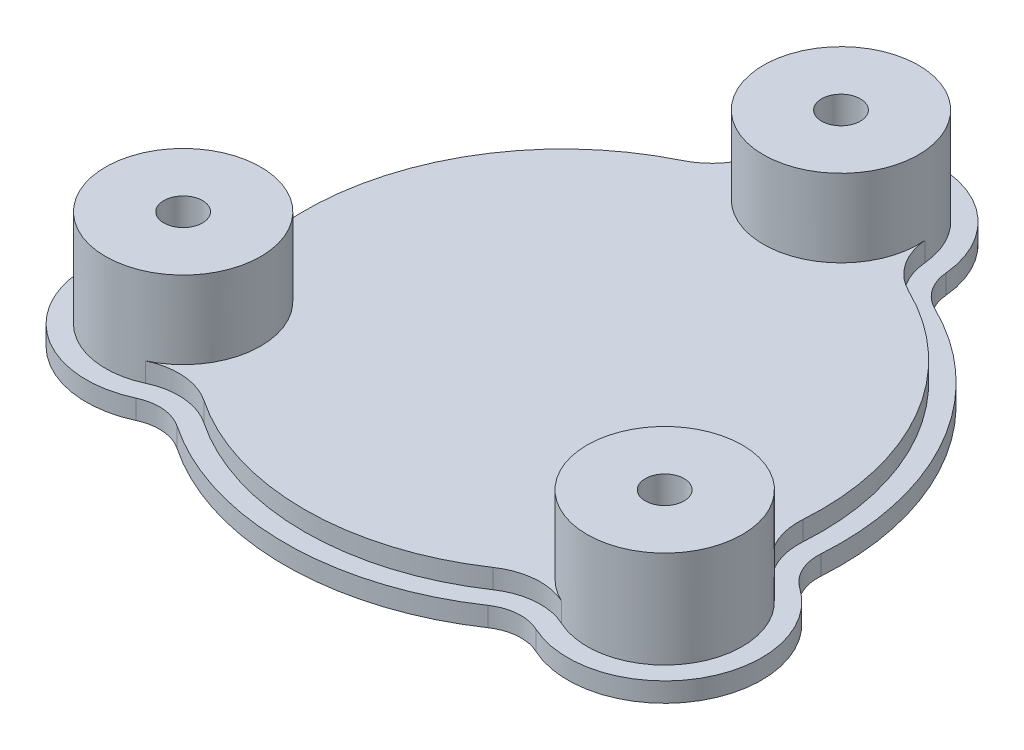
ISO-10303-21;
HEADER;
FILE_DESCRIPTION(('STEP AP214'),'2;1');
FILE_NAME('part.step','',(''),(''),'','','');
FILE_SCHEMA(('AUTOMOTIVE_DESIGN { 1 0 10303 214 1 1 1 1 }'));
ENDSEC;
DATA;
#1=APPLICATION_CONTEXT('core data for automotive mechanical design processes');
#2=APPLICATION_PROTOCOL_DEFINITION('international standard','automotive_design',2000,#1);
#3=PRODUCT_CONTEXT('',#1,'mechanical');
#4=PRODUCT('Part','Part','',(#3));
#5=PRODUCT_RELATED_PRODUCT_CATEGORY('part','',(#4));
#6=PRODUCT_DEFINITION_FORMATION('','',#4);
#7=PRODUCT_DEFINITION_CONTEXT('part definition',#1,'design');
#8=PRODUCT_DEFINITION('design','',#6,#7);
#9=PRODUCT_DEFINITION_SHAPE('','',#8);
#10=(LENGTH_UNIT() NAMED_UNIT(*) SI_UNIT(.MILLI.,.METRE.));
#11=(NAMED_UNIT(*) PLANE_ANGLE_UNIT() SI_UNIT($,.RADIAN.));
#12=(NAMED_UNIT(*) SI_UNIT($,.STERADIAN.) SOLID_ANGLE_UNIT());
#13=UNCERTAINTY_MEASURE_WITH_UNIT(LENGTH_MEASURE(1.E-05),#10,'distance_accuracy_value','');
#14=(GEOMETRIC_REPRESENTATION_CONTEXT(3) GLOBAL_UNCERTAINTY_ASSIGNED_CONTEXT((#13)) GLOBAL_UNIT_ASSIGNED_CONTEXT((#10,
#11,#12)) REPRESENTATION_CONTEXT('',''));
#15=CARTESIAN_POINT('',(0.,0.,0.));
#16=DIRECTION('',(0.,0.,1.));
#17=DIRECTION('',(1.,0.,0.));
#18=AXIS2_PLACEMENT_3D('',#15,#16,#17);
#19=CARTESIAN_POINT('',(43.5584755901521,6.,12.496367642724));
#20=DIRECTION('',(0.,1.,0.));
#21=DIRECTION('',(0.,0.,1.));
#22=AXIS2_PLACEMENT_3D('',#19,#20,#21);
#23=PLANE('',#22);
#24=CARTESIAN_POINT('',(27.963726894679,6.,41.4491251796682));
#25=DIRECTION('',(0.,-1.,0.));
#26=DIRECTION('',(0.,0.,1.));
#27=AXIS2_PLACEMENT_3D('',#24,#25,#26);
#28=CIRCLE('',#27,10.);
#29=CARTESIAN_POINT('',(22.3709815157432,6.,33.1593001437346));
#30=VERTEX_POINT('',#29);
#31=CARTESIAN_POINT('',(32.1798021074299,6.,32.3813410070917));
#32=VERTEX_POINT('',#31);
#33=EDGE_CURVE('E229',#30,#32,#28,.T.);
#34=ORIENTED_EDGE('',*,*,#33,.T.);
#35=CARTESIAN_POINT('',(37.2390923627309,6.,21.5));
#36=DIRECTION('',(0.,1.,0.));
#37=DIRECTION('',(0.,0.,1.));
#38=AXIS2_PLACEMENT_3D('',#35,#36,#37);
#39=CIRCLE('',#38,12.0000000000002);
#40=CARTESIAN_POINT('',(44.1329649744632,6.,11.6778556102443));
#41=VERTEX_POINT('',#40);
#42=EDGE_CURVE('E212',#41,#32,#39,.T.);
#43=ORIENTED_EDGE('',*,*,#42,.F.);
#44=CARTESIAN_POINT('',(49.8778588175734,6.,3.49273528544806));
#45=DIRECTION('',(0.,-1.,0.));
#46=DIRECTION('',(0.,0.,1.));
#47=AXIS2_PLACEMENT_3D('',#44,#45,#46);
#48=CIRCLE('',#47,9.99999999999999);
#49=CARTESIAN_POINT('',(39.9022870540587,6.,2.79418822835846));
#50=VERTEX_POINT('',#49);
#51=EDGE_CURVE('E220',#41,#50,#48,.T.);
#52=ORIENTED_EDGE('',*,*,#51,.T.);
#53=CARTESIAN_POINT('',(0.,6.,0.));
#54=DIRECTION('',(0.,1.,0.));
#55=DIRECTION('',(0.,0.,1.));
#56=AXIS2_PLACEMENT_3D('',#53,#54,#55);
#57=CIRCLE('',#56,40.);
#58=CARTESIAN_POINT('',(17.5313055383155,6.,-35.953488372093));
#59=VERTEX_POINT('',#58);
#60=EDGE_CURVE('E226',#50,#59,#57,.T.);
#61=ORIENTED_EDGE('',*,*,#60,.T.);
#62=CARTESIAN_POINT('',(21.9141319228944,6.,-44.9418604651163));
#63=DIRECTION('',(0.,-1.,0.));
#64=DIRECTION('',(0.,0.,1.));
#65=AXIS2_PLACEMENT_3D('',#62,#63,#64);
#66=CIRCLE('',#65,10.);
#67=CARTESIAN_POINT('',(11.9531628670333,6.,-44.0591966173361));
#68=VERTEX_POINT('',#67);
#69=EDGE_CURVE('E254',#59,#68,#66,.T.);
#70=ORIENTED_EDGE('',*,*,#69,.T.);
#71=CARTESIAN_POINT('',(0.,6.,-43.));
#72=DIRECTION('',(0.,1.,0.));
#73=DIRECTION('',(0.,0.,1.));
#74=AXIS2_PLACEMENT_3D('',#71,#72,#73);
#75=CIRCLE('',#74,12.);
#76=CARTESIAN_POINT('',(-11.9531628670333,6.,-44.0591966173361));
#77=VERTEX_POINT('',#76);
#78=EDGE_CURVE('E12',#77,#68,#75,.T.);
#79=ORIENTED_EDGE('',*,*,#78,.F.);
#80=CARTESIAN_POINT('',(-21.9141319228944,6.,-44.9418604651163));
#81=DIRECTION('',(0.,-1.,0.));
#82=DIRECTION('',(0.,0.,1.));
#83=AXIS2_PLACEMENT_3D('',#80,#81,#82);
#84=CIRCLE('',#83,10.);
#85=CARTESIAN_POINT('',(-17.5313055383155,6.,-35.953488372093));
#86=VERTEX_POINT('',#85);
#87=EDGE_CURVE('E258',#77,#86,#84,.T.);
#88=ORIENTED_EDGE('',*,*,#87,.T.);
#89=CARTESIAN_POINT('',(0.,6.,0.));
#90=DIRECTION('',(0.,1.,0.));
#91=DIRECTION('',(0.,0.,1.));
#92=AXIS2_PLACEMENT_3D('',#89,#90,#91);
#93=CIRCLE('',#92,40.);
#94=CARTESIAN_POINT('',(-39.7921258564291,6.,4.07267968616522));
#95=VERTEX_POINT('',#94);
#96=EDGE_CURVE('E261',#86,#95,#93,.T.);
#97=ORIENTED_EDGE('',*,*,#96,.T.);
#98=CARTESIAN_POINT('',(-47.1517620795026,6.,4.82593024260501));
#99=DIRECTION('',(0.,-1.,0.));
#100=DIRECTION('',(0.,0.,1.));
#101=AXIS2_PLACEMENT_3D('',#98,#99,#100);
#102=CIRCLE('',#101,7.39808297714696);
#103=CARTESIAN_POINT('',(-43.3712465937133,6.,11.1851231472478));
#104=VERTEX_POINT('',#103);
#105=EDGE_CURVE('E264',#95,#104,#102,.T.);
#106=ORIENTED_EDGE('',*,*,#105,.T.);
#107=CARTESIAN_POINT('',(-37.2390923627308,6.,21.5));
#108=DIRECTION('',(0.,1.,0.));
#109=DIRECTION('',(0.,0.,1.));
#110=AXIS2_PLACEMENT_3D('',#107,#108,#109);
#111=CIRCLE('',#110,12.0000000000004);
#112=CARTESIAN_POINT('',(-32.1798021074298,6.,32.3813410070919));
#113=VERTEX_POINT('',#112);
#114=EDGE_CURVE('E238',#113,#104,#111,.T.);
#115=ORIENTED_EDGE('',*,*,#114,.F.);
#116=CARTESIAN_POINT('',(-27.963726894679,6.,41.4491251796682));
#117=DIRECTION('',(0.,-1.,0.));
#118=DIRECTION('',(0.,0.,1.));
#119=AXIS2_PLACEMENT_3D('',#116,#117,#118);
#120=CIRCLE('',#119,10.);
#121=CARTESIAN_POINT('',(-22.3709815157432,6.,33.1593001437346));
#122=VERTEX_POINT('',#121);
#123=EDGE_CURVE('E267',#113,#122,#120,.T.);
#124=ORIENTED_EDGE('',*,*,#123,.T.);
#125=CARTESIAN_POINT('',(0.,6.,0.));
#126=DIRECTION('',(0.,1.,0.));
#127=DIRECTION('',(0.,0.,1.));
#128=AXIS2_PLACEMENT_3D('',#125,#126,#127);
#129=CIRCLE('',#128,40.);
#130=EDGE_CURVE('E270',#122,#30,#129,.T.);
#131=ORIENTED_EDGE('',*,*,#130,.T.);
#132=EDGE_LOOP('',(#34,#43,#52,#61,#70,#79,#88,#97,#106,#115,#124,#131));
#133=FACE_BOUND('',#132,.T.);
#134=ADVANCED_FACE('F45',(#133),#23,.T.);
#135=CARTESIAN_POINT('',(0.,3.,0.));
#136=DIRECTION('',(0.,1.,0.));
#137=DIRECTION('',(0.,0.,1.));
#138=AXIS2_PLACEMENT_3D('',#135,#136,#137);
#139=PLANE('',#138);
#140=CARTESIAN_POINT('',(27.963726894679,3.,41.4491251796682));
#141=DIRECTION('',(0.,1.,0.));
#142=DIRECTION('',(0.,0.,1.));
#143=AXIS2_PLACEMENT_3D('',#140,#141,#142);
#144=CIRCLE('',#143,7.);
#145=CARTESIAN_POINT('',(24.048805129424,3.,35.6462476545146));
#146=VERTEX_POINT('',#145);
#147=CARTESIAN_POINT('',(30.9149795436046,3.,35.1016762588647));
#148=VERTEX_POINT('',#147);
#149=EDGE_CURVE('E358',#146,#148,#144,.F.);
#150=ORIENTED_EDGE('',*,*,#149,.T.);
#151=CARTESIAN_POINT('',(37.2390923627309,3.,21.5));
#152=DIRECTION('',(0.,1.,0.));
#153=DIRECTION('',(0.,0.,1.));
#154=AXIS2_PLACEMENT_3D('',#151,#152,#153);
#155=CIRCLE('',#154,15.);
#156=CARTESIAN_POINT('',(45.8564331273963,3.,9.2223195128055));
#157=VERTEX_POINT('',#156);
#158=EDGE_CURVE('E362',#148,#157,#155,.T.);
#159=ORIENTED_EDGE('',*,*,#158,.T.);
#160=CARTESIAN_POINT('',(49.8778588175734,3.,3.49273528544806));
#161=DIRECTION('',(0.,1.,0.));
#162=DIRECTION('',(0.,0.,1.));
#163=AXIS2_PLACEMENT_3D('',#160,#161,#162);
#164=CIRCLE('',#163,7.);
#165=CARTESIAN_POINT('',(42.8949585831131,3.,3.00375234548533));
#166=VERTEX_POINT('',#165);
#167=EDGE_CURVE('E366',#166,#157,#164,.T.);
#168=ORIENTED_EDGE('',*,*,#167,.F.);
#169=CARTESIAN_POINT('',(0.,3.,0.));
#170=DIRECTION('',(0.,1.,0.));
#171=DIRECTION('',(0.,0.,1.));
#172=AXIS2_PLACEMENT_3D('',#169,#170,#171);
#173=CIRCLE('',#172,43.);
#174=CARTESIAN_POINT('',(18.8461534536892,3.,-38.65));
#175=VERTEX_POINT('',#174);
#176=EDGE_CURVE('E370',#166,#175,#173,.T.);
#177=ORIENTED_EDGE('',*,*,#176,.T.);
#178=CARTESIAN_POINT('',(21.9141319228944,3.,-44.9418604651163));
#179=DIRECTION('',(0.,1.,0.));
#180=DIRECTION('',(0.,0.,1.));
#181=AXIS2_PLACEMENT_3D('',#178,#179,#180);
#182=CIRCLE('',#181,7.);
#183=CARTESIAN_POINT('',(14.9414535837916,3.,-44.3239957716702));
#184=VERTEX_POINT('',#183);
#185=EDGE_CURVE('E373',#184,#175,#182,.T.);
#186=ORIENTED_EDGE('',*,*,#185,.F.);
#187=CARTESIAN_POINT('',(0.,3.,-43.));
#188=DIRECTION('',(0.,1.,0.));
#189=DIRECTION('',(0.,0.,1.));
#190=AXIS2_PLACEMENT_3D('',#187,#188,#189);
#191=CIRCLE('',#190,15.);
#192=CARTESIAN_POINT('',(-14.9414535837916,3.,-44.3239957716702));
#193=VERTEX_POINT('',#192);
#194=EDGE_CURVE('E377',#184,#193,#191,.T.);
#195=ORIENTED_EDGE('',*,*,#194,.T.);
#196=CARTESIAN_POINT('',(-21.9141319228944,3.,-44.9418604651163));
#197=DIRECTION('',(0.,1.,0.));
#198=DIRECTION('',(0.,0.,1.));
#199=AXIS2_PLACEMENT_3D('',#196,#197,#198);
#200=CIRCLE('',#199,7.);
#201=CARTESIAN_POINT('',(-18.8461534536892,3.,-38.65));
#202=VERTEX_POINT('',#201);
#203=EDGE_CURVE('E380',#202,#193,#200,.T.);
#204=ORIENTED_EDGE('',*,*,#203,.F.);
#205=CARTESIAN_POINT('',(0.,3.,0.));
#206=DIRECTION('',(0.,1.,0.));
#207=DIRECTION('',(0.,0.,1.));
#208=AXIS2_PLACEMENT_3D('',#205,#206,#207);
#209=CIRCLE('',#208,43.);
#210=CARTESIAN_POINT('',(-42.7765352956613,3.,4.37813066262762));
#211=VERTEX_POINT('',#210);
#212=EDGE_CURVE('E384',#202,#211,#209,.T.);
#213=ORIENTED_EDGE('',*,*,#212,.T.);
#214=CARTESIAN_POINT('',(-47.1517620795026,3.,4.82593024260501));
#215=DIRECTION('',(0.,1.,0.));
#216=DIRECTION('',(0.,0.,1.));
#217=AXIS2_PLACEMENT_3D('',#214,#215,#216);
#218=CIRCLE('',#217,4.39808297714695);
#219=CARTESIAN_POINT('',(-44.9042851514589,3.,8.60640393405973));
#220=VERTEX_POINT('',#219);
#221=EDGE_CURVE('E387',#220,#211,#218,.T.);
#222=ORIENTED_EDGE('',*,*,#221,.F.);
#223=CARTESIAN_POINT('',(-37.2390923627309,3.,21.5));
#224=DIRECTION('',(0.,1.,0.));
#225=DIRECTION('',(0.,0.,1.));
#226=AXIS2_PLACEMENT_3D('',#223,#224,#225);
#227=CIRCLE('',#226,15.);
#228=CARTESIAN_POINT('',(-30.9149795436046,3.,35.1016762588647));
#229=VERTEX_POINT('',#228);
#230=EDGE_CURVE('E391',#220,#229,#227,.T.);
#231=ORIENTED_EDGE('',*,*,#230,.T.);
#232=CARTESIAN_POINT('',(-27.963726894679,3.,41.4491251796682));
#233=DIRECTION('',(0.,1.,0.));
#234=DIRECTION('',(0.,0.,1.));
#235=AXIS2_PLACEMENT_3D('',#232,#233,#234);
#236=CIRCLE('',#235,7.00000000000001);
#237=CARTESIAN_POINT('',(-24.0488051294239,3.,35.6462476545147));
#238=VERTEX_POINT('',#237);
#239=EDGE_CURVE('E394',#229,#238,#236,.F.);
#240=ORIENTED_EDGE('',*,*,#239,.T.);
#241=CARTESIAN_POINT('',(0.,3.,0.));
#242=DIRECTION('',(0.,1.,0.));
#243=DIRECTION('',(0.,0.,1.));
#244=AXIS2_PLACEMENT_3D('',#241,#242,#243);
#245=CIRCLE('',#244,43.);
#246=EDGE_CURVE('E397',#238,#146,#245,.T.);
#247=ORIENTED_EDGE('',*,*,#246,.T.);
#248=EDGE_LOOP('',(#150,#159,#168,#177,#186,#195,#204,#213,#222,#231,#240,#247));
#249=FACE_BOUND('',#248,.T.);
#250=CARTESIAN_POINT('',(37.2390923627309,3.,21.5));
#251=DIRECTION('',(0.,1.,0.));
#252=DIRECTION('',(0.,0.,1.));
#253=AXIS2_PLACEMENT_3D('',#250,#251,#252);
#254=CIRCLE('',#253,12.);
#255=CARTESIAN_POINT('',(32.1798021074299,3.,32.3813410070917));
#256=VERTEX_POINT('',#255);
#257=CARTESIAN_POINT('',(44.1329649744632,3.,11.6778556102444));
#258=VERTEX_POINT('',#257);
#259=EDGE_CURVE('E62',#256,#258,#254,.T.);
#260=ORIENTED_EDGE('',*,*,#259,.F.);
#261=CARTESIAN_POINT('',(27.963726894679,3.,41.4491251796682));
#262=DIRECTION('',(0.,-1.,0.));
#263=DIRECTION('',(0.,0.,1.));
#264=AXIS2_PLACEMENT_3D('',#261,#262,#263);
#265=CIRCLE('',#264,10.);
#266=CARTESIAN_POINT('',(22.3709815157432,3.,33.1593001437346));
#267=VERTEX_POINT('',#266);
#268=EDGE_CURVE('E66',#267,#256,#265,.T.);
#269=ORIENTED_EDGE('',*,*,#268,.F.);
#270=CARTESIAN_POINT('',(0.,3.,0.));
#271=DIRECTION('',(0.,1.,0.));
#272=DIRECTION('',(0.,0.,1.));
#273=AXIS2_PLACEMENT_3D('',#270,#271,#272);
#274=CIRCLE('',#273,40.);
#275=CARTESIAN_POINT('',(-22.3709815157432,3.,33.1593001437346));
#276=VERTEX_POINT('',#275);
#277=EDGE_CURVE('E313',#276,#267,#274,.T.);
#278=ORIENTED_EDGE('',*,*,#277,.F.);
#279=CARTESIAN_POINT('',(-27.963726894679,3.,41.4491251796682));
#280=DIRECTION('',(0.,-1.,0.));
#281=DIRECTION('',(0.,0.,1.));
#282=AXIS2_PLACEMENT_3D('',#279,#280,#281);
#283=CIRCLE('',#282,10.);
#284=CARTESIAN_POINT('',(-32.1798021074298,3.,32.3813410070917));
#285=VERTEX_POINT('',#284);
#286=EDGE_CURVE('E309',#285,#276,#283,.T.);
#287=ORIENTED_EDGE('',*,*,#286,.F.);
#288=CARTESIAN_POINT('',(-37.2390923627309,3.,21.5));
#289=DIRECTION('',(0.,1.,0.));
#290=DIRECTION('',(0.,0.,1.));
#291=AXIS2_PLACEMENT_3D('',#288,#289,#290);
#292=CIRCLE('',#291,12.);
#293=CARTESIAN_POINT('',(-43.3712465937133,3.,11.1851231472478));
#294=VERTEX_POINT('',#293);
#295=EDGE_CURVE('E305',#294,#285,#292,.T.);
#296=ORIENTED_EDGE('',*,*,#295,.F.);
#297=CARTESIAN_POINT('',(-47.1517620795026,3.,4.82593024260501));
#298=DIRECTION('',(0.,-1.,0.));
#299=DIRECTION('',(0.,0.,1.));
#300=AXIS2_PLACEMENT_3D('',#297,#298,#299);
#301=CIRCLE('',#300,7.39808297714696);
#302=CARTESIAN_POINT('',(-39.7921258564291,3.,4.07267968616522));
#303=VERTEX_POINT('',#302);
#304=EDGE_CURVE('E301',#303,#294,#301,.T.);
#305=ORIENTED_EDGE('',*,*,#304,.F.);
#306=CARTESIAN_POINT('',(0.,3.,0.));
#307=DIRECTION('',(0.,1.,0.));
#308=DIRECTION('',(0.,0.,1.));
#309=AXIS2_PLACEMENT_3D('',#306,#307,#308);
#310=CIRCLE('',#309,40.);
#311=CARTESIAN_POINT('',(-17.5313055383155,3.,-35.953488372093));
#312=VERTEX_POINT('',#311);
#313=EDGE_CURVE('E297',#312,#303,#310,.T.);
#314=ORIENTED_EDGE('',*,*,#313,.F.);
#315=CARTESIAN_POINT('',(-21.9141319228944,3.,-44.9418604651163));
#316=DIRECTION('',(0.,-1.,0.));
#317=DIRECTION('',(0.,0.,1.));
#318=AXIS2_PLACEMENT_3D('',#315,#316,#317);
#319=CIRCLE('',#318,10.);
#320=CARTESIAN_POINT('',(-11.9531628670333,3.,-44.0591966173361));
#321=VERTEX_POINT('',#320);
#322=EDGE_CURVE('E293',#321,#312,#319,.T.);
#323=ORIENTED_EDGE('',*,*,#322,.F.);
#324=CARTESIAN_POINT('',(0.,3.,-43.));
#325=DIRECTION('',(0.,1.,0.));
#326=DIRECTION('',(0.,0.,1.));
#327=AXIS2_PLACEMENT_3D('',#324,#325,#326);
#328=CIRCLE('',#327,12.);
#329=CARTESIAN_POINT('',(11.9531628670333,3.,-44.0591966173362));
#330=VERTEX_POINT('',#329);
#331=EDGE_CURVE('E289',#330,#321,#328,.T.);
#332=ORIENTED_EDGE('',*,*,#331,.F.);
#333=CARTESIAN_POINT('',(21.9141319228944,3.,-44.9418604651163));
#334=DIRECTION('',(0.,-1.,0.));
#335=DIRECTION('',(0.,0.,1.));
#336=AXIS2_PLACEMENT_3D('',#333,#334,#335);
#337=CIRCLE('',#336,10.);
#338=CARTESIAN_POINT('',(17.5313055383155,3.,-35.953488372093));
#339=VERTEX_POINT('',#338);
#340=EDGE_CURVE('E285',#339,#330,#337,.T.);
#341=ORIENTED_EDGE('',*,*,#340,.F.);
#342=CARTESIAN_POINT('',(0.,3.,0.));
#343=DIRECTION('',(0.,1.,0.));
#344=DIRECTION('',(0.,0.,1.));
#345=AXIS2_PLACEMENT_3D('',#342,#343,#344);
#346=CIRCLE('',#345,40.);
#347=CARTESIAN_POINT('',(39.9022870540587,3.,2.79418822835846));
#348=VERTEX_POINT('',#347);
#349=EDGE_CURVE('E281',#348,#339,#346,.T.);
#350=ORIENTED_EDGE('',*,*,#349,.F.);
#351=CARTESIAN_POINT('',(49.8778588175734,3.,3.49273528544806));
#352=DIRECTION('',(0.,-1.,0.));
#353=DIRECTION('',(0.,0.,1.));
#354=AXIS2_PLACEMENT_3D('',#351,#352,#353);
#355=CIRCLE('',#354,9.99999999999999);
#356=EDGE_CURVE('E278',#258,#348,#355,.T.);
#357=ORIENTED_EDGE('',*,*,#356,.F.);
#358=EDGE_LOOP('',(#260,#269,#278,#287,#296,#305,#314,#323,#332,#341,#350,#357));
#359=FACE_BOUND('',#358,.T.);
#360=ADVANCED_FACE('F515',(#249,#359),#139,.T.);
#361=CARTESIAN_POINT('',(27.963726894679,3.,41.4491251796682));
#362=DIRECTION('',(0.,-1.,0.));
#363=DIRECTION('',(0.,0.,-1.));
#364=AXIS2_PLACEMENT_3D('',#361,#362,#363);
#365=CYLINDRICAL_SURFACE('',#364,7.);
#366=CARTESIAN_POINT('',(27.963726894679,0.,41.4491251796682));
#367=DIRECTION('',(0.,1.,0.));
#368=DIRECTION('',(0.,0.,1.));
#369=AXIS2_PLACEMENT_3D('',#366,#367,#368);
#370=CIRCLE('',#369,7.);
#371=CARTESIAN_POINT('',(24.048805129424,0.,35.6462476545146));
#372=VERTEX_POINT('',#371);
#373=CARTESIAN_POINT('',(30.9149795436046,0.,35.1016762588647));
#374=VERTEX_POINT('',#373);
#375=EDGE_CURVE('E216',#372,#374,#370,.F.);
#376=ORIENTED_EDGE('',*,*,#375,.T.);
#377=DIRECTION('',(0.,-1.,0.));
#378=VECTOR('',#377,1.);
#379=CARTESIAN_POINT('',(30.9149795436046,3.,35.1016762588647));
#380=LINE('',#379,#378);
#381=EDGE_CURVE('E49',#148,#374,#380,.T.);
#382=ORIENTED_EDGE('',*,*,#381,.F.);
#383=ORIENTED_EDGE('',*,*,#149,.F.);
#384=DIRECTION('',(0.,-1.,0.));
#385=VECTOR('',#384,1.);
#386=CARTESIAN_POINT('',(24.048805129424,3.,35.6462476545146));
#387=LINE('',#386,#385);
#388=EDGE_CURVE('E400',#146,#372,#387,.T.);
#389=ORIENTED_EDGE('',*,*,#388,.T.);
#390=EDGE_LOOP('',(#376,#382,#383,#389));
#391=FACE_BOUND('',#390,.T.);
#392=ADVANCED_FACE('F47',(#391),#365,.F.);
#393=CARTESIAN_POINT('',(37.2390923627309,3.,21.5));
#394=DIRECTION('',(0.,-1.,0.));
#395=DIRECTION('',(0.,0.,-1.));
#396=AXIS2_PLACEMENT_3D('',#393,#394,#395);
#397=CYLINDRICAL_SURFACE('',#396,15.);
#398=CARTESIAN_POINT('',(37.2390923627309,0.,21.5));
#399=DIRECTION('',(0.,1.,0.));
#400=DIRECTION('',(0.,0.,1.));
#401=AXIS2_PLACEMENT_3D('',#398,#399,#400);
#402=CIRCLE('',#401,15.);
#403=CARTESIAN_POINT('',(45.8564331273963,0.,9.2223195128055));
#404=VERTEX_POINT('',#403);
#405=EDGE_CURVE('E404',#374,#404,#402,.T.);
#406=ORIENTED_EDGE('',*,*,#405,.T.);
#407=DIRECTION('',(0.,-1.,0.));
#408=VECTOR('',#407,1.);
#409=CARTESIAN_POINT('',(45.8564331273963,3.,9.2223195128055));
#410=LINE('',#409,#408);
#411=EDGE_CURVE('E487',#157,#404,#410,.T.);
#412=ORIENTED_EDGE('',*,*,#411,.F.);
#413=ORIENTED_EDGE('',*,*,#158,.F.);
#414=ORIENTED_EDGE('',*,*,#381,.T.);
#415=EDGE_LOOP('',(#406,#412,#413,#414));
#416=FACE_BOUND('',#415,.T.);
#417=ADVANCED_FACE('F496',(#416),#397,.T.);
#418=CARTESIAN_POINT('',(49.8778588175734,3.,3.49273528544806));
#419=DIRECTION('',(0.,-1.,0.));
#420=DIRECTION('',(0.,0.,-1.));
#421=AXIS2_PLACEMENT_3D('',#418,#419,#420);
#422=CYLINDRICAL_SURFACE('',#421,7.);
#423=CARTESIAN_POINT('',(49.8778588175734,0.,3.49273528544806));
#424=DIRECTION('',(0.,1.,0.));
#425=DIRECTION('',(0.,0.,1.));
#426=AXIS2_PLACEMENT_3D('',#423,#424,#425);
#427=CIRCLE('',#426,7.);
#428=CARTESIAN_POINT('',(42.8949585831131,0.,3.00375234548533));
#429=VERTEX_POINT('',#428);
#430=EDGE_CURVE('E408',#429,#404,#427,.T.);
#431=ORIENTED_EDGE('',*,*,#430,.F.);
#432=DIRECTION('',(0.,-1.,0.));
#433=VECTOR('',#432,1.);
#434=CARTESIAN_POINT('',(42.8949585831131,3.,3.00375234548533));
#435=LINE('',#434,#433);
#436=EDGE_CURVE('E485',#166,#429,#435,.T.);
#437=ORIENTED_EDGE('',*,*,#436,.F.);
#438=ORIENTED_EDGE('',*,*,#167,.T.);
#439=ORIENTED_EDGE('',*,*,#411,.T.);
#440=EDGE_LOOP('',(#431,#437,#438,#439));
#441=FACE_BOUND('',#440,.T.);
#442=ADVANCED_FACE('F507',(#441),#422,.F.);
#443=CARTESIAN_POINT('',(0.,3.,0.));
#444=DIRECTION('',(0.,-1.,0.));
#445=DIRECTION('',(0.,0.,-1.));
#446=AXIS2_PLACEMENT_3D('',#443,#444,#445);
#447=CYLINDRICAL_SURFACE('',#446,43.);
#448=CARTESIAN_POINT('',(0.,0.,0.));
#449=DIRECTION('',(0.,1.,0.));
#450=DIRECTION('',(0.,0.,1.));
#451=AXIS2_PLACEMENT_3D('',#448,#449,#450);
#452=CIRCLE('',#451,43.);
#453=CARTESIAN_POINT('',(18.8461534536892,0.,-38.65));
#454=VERTEX_POINT('',#453);
#455=EDGE_CURVE('E412',#429,#454,#452,.T.);
#456=ORIENTED_EDGE('',*,*,#455,.T.);
#457=DIRECTION('',(0.,-1.,0.));
#458=VECTOR('',#457,1.);
#459=CARTESIAN_POINT('',(18.8461534536892,3.,-38.65));
#460=LINE('',#459,#458);
#461=EDGE_CURVE('E482',#175,#454,#460,.T.);
#462=ORIENTED_EDGE('',*,*,#461,.F.);
#463=ORIENTED_EDGE('',*,*,#176,.F.);
#464=ORIENTED_EDGE('',*,*,#436,.T.);
#465=EDGE_LOOP('',(#456,#462,#463,#464));
#466=FACE_BOUND('',#465,.T.);
#467=ADVANCED_FACE('F512',(#466),#447,.T.);
#468=CARTESIAN_POINT('',(21.9141319228944,3.,-44.9418604651163));
#469=DIRECTION('',(0.,-1.,0.));
#470=DIRECTION('',(0.,0.,-1.));
#471=AXIS2_PLACEMENT_3D('',#468,#469,#470);
#472=CYLINDRICAL_SURFACE('',#471,7.);
#473=CARTESIAN_POINT('',(21.9141319228944,0.,-44.9418604651163));
#474=DIRECTION('',(0.,1.,0.));
#475=DIRECTION('',(0.,0.,1.));
#476=AXIS2_PLACEMENT_3D('',#473,#474,#475);
#477=CIRCLE('',#476,7.);
#478=CARTESIAN_POINT('',(14.9414535837916,0.,-44.3239957716702));
#479=VERTEX_POINT('',#478);
#480=EDGE_CURVE('E416',#479,#454,#477,.T.);
#481=ORIENTED_EDGE('',*,*,#480,.F.);
#482=DIRECTION('',(0.,-1.,0.));
#483=VECTOR('',#482,1.);
#484=CARTESIAN_POINT('',(14.9414535837916,3.,-44.3239957716702));
#485=LINE('',#484,#483);
#486=EDGE_CURVE('E479',#184,#479,#485,.T.);
#487=ORIENTED_EDGE('',*,*,#486,.F.);
#488=ORIENTED_EDGE('',*,*,#185,.T.);
#489=ORIENTED_EDGE('',*,*,#461,.T.);
#490=EDGE_LOOP('',(#481,#487,#488,#489));
#491=FACE_BOUND('',#490,.T.);
#492=ADVANCED_FACE('F547',(#491),#472,.F.);
#493=CARTESIAN_POINT('',(0.,3.,-43.));
#494=DIRECTION('',(0.,-1.,0.));
#495=DIRECTION('',(0.,0.,-1.));
#496=AXIS2_PLACEMENT_3D('',#493,#494,#495);
#497=CYLINDRICAL_SURFACE('',#496,15.);
#498=CARTESIAN_POINT('',(0.,0.,-43.));
#499=DIRECTION('',(0.,1.,0.));
#500=DIRECTION('',(0.,0.,1.));
#501=AXIS2_PLACEMENT_3D('',#498,#499,#500);
#502=CIRCLE('',#501,15.);
#503=CARTESIAN_POINT('',(-14.9414535837916,0.,-44.3239957716702));
#504=VERTEX_POINT('',#503);
#505=EDGE_CURVE('E420',#479,#504,#502,.T.);
#506=ORIENTED_EDGE('',*,*,#505,.T.);
#507=DIRECTION('',(0.,-1.,0.));
#508=VECTOR('',#507,1.);
#509=CARTESIAN_POINT('',(-14.9414535837916,3.,-44.3239957716702));
#510=LINE('',#509,#508);
#511=EDGE_CURVE('E476',#193,#504,#510,.T.);
#512=ORIENTED_EDGE('',*,*,#511,.F.);
#513=ORIENTED_EDGE('',*,*,#194,.F.);
#514=ORIENTED_EDGE('',*,*,#486,.T.);
#515=EDGE_LOOP('',(#506,#512,#513,#514));
#516=FACE_BOUND('',#515,.T.);
#517=ADVANCED_FACE('F544',(#516),#497,.T.);
#518=CARTESIAN_POINT('',(-21.9141319228944,3.,-44.9418604651163));
#519=DIRECTION('',(0.,-1.,0.));
#520=DIRECTION('',(0.,0.,-1.));
#521=AXIS2_PLACEMENT_3D('',#518,#519,#520);
#522=CYLINDRICAL_SURFACE('',#521,7.);
#523=CARTESIAN_POINT('',(-21.9141319228944,0.,-44.9418604651163));
#524=DIRECTION('',(0.,1.,0.));
#525=DIRECTION('',(0.,0.,1.));
#526=AXIS2_PLACEMENT_3D('',#523,#524,#525);
#527=CIRCLE('',#526,7.);
#528=CARTESIAN_POINT('',(-18.8461534536892,0.,-38.65));
#529=VERTEX_POINT('',#528);
#530=EDGE_CURVE('E424',#529,#504,#527,.T.);
#531=ORIENTED_EDGE('',*,*,#530,.F.);
#532=DIRECTION('',(0.,-1.,0.));
#533=VECTOR('',#532,1.);
#534=CARTESIAN_POINT('',(-18.8461534536892,3.,-38.65));
#535=LINE('',#534,#533);
#536=EDGE_CURVE('E473',#202,#529,#535,.T.);
#537=ORIENTED_EDGE('',*,*,#536,.F.);
#538=ORIENTED_EDGE('',*,*,#203,.T.);
#539=ORIENTED_EDGE('',*,*,#511,.T.);
#540=EDGE_LOOP('',(#531,#537,#538,#539));
#541=FACE_BOUND('',#540,.T.);
#542=ADVANCED_FACE('F539',(#541),#522,.F.);
#543=CARTESIAN_POINT('',(0.,3.,0.));
#544=DIRECTION('',(0.,-1.,0.));
#545=DIRECTION('',(0.,0.,-1.));
#546=AXIS2_PLACEMENT_3D('',#543,#544,#545);
#547=CYLINDRICAL_SURFACE('',#546,43.);
#548=CARTESIAN_POINT('',(0.,0.,0.));
#549=DIRECTION('',(0.,1.,0.));
#550=DIRECTION('',(0.,0.,1.));
#551=AXIS2_PLACEMENT_3D('',#548,#549,#550);
#552=CIRCLE('',#551,43.);
#553=CARTESIAN_POINT('',(-42.7765352956613,0.,4.37813066262762));
#554=VERTEX_POINT('',#553);
#555=EDGE_CURVE('E428',#529,#554,#552,.T.);
#556=ORIENTED_EDGE('',*,*,#555,.T.);
#557=DIRECTION('',(0.,-1.,0.));
#558=VECTOR('',#557,1.);
#559=CARTESIAN_POINT('',(-42.7765352956613,3.,4.37813066262762));
#560=LINE('',#559,#558);
#561=EDGE_CURVE('E470',#211,#554,#560,.T.);
#562=ORIENTED_EDGE('',*,*,#561,.F.);
#563=ORIENTED_EDGE('',*,*,#212,.F.);
#564=ORIENTED_EDGE('',*,*,#536,.T.);
#565=EDGE_LOOP('',(#556,#562,#563,#564));
#566=FACE_BOUND('',#565,.T.);
#567=ADVANCED_FACE('F535',(#566),#547,.T.);
#568=CARTESIAN_POINT('',(-47.1517620795026,3.,4.82593024260501));
#569=DIRECTION('',(0.,-1.,0.));
#570=DIRECTION('',(0.,0.,-1.));
#571=AXIS2_PLACEMENT_3D('',#568,#569,#570);
#572=CYLINDRICAL_SURFACE('',#571,4.39808297714695);
#573=CARTESIAN_POINT('',(-47.1517620795026,0.,4.82593024260501));
#574=DIRECTION('',(0.,1.,0.));
#575=DIRECTION('',(0.,0.,1.));
#576=AXIS2_PLACEMENT_3D('',#573,#574,#575);
#577=CIRCLE('',#576,4.39808297714695);
#578=CARTESIAN_POINT('',(-44.9042851514589,0.,8.60640393405973));
#579=VERTEX_POINT('',#578);
#580=EDGE_CURVE('E432',#579,#554,#577,.T.);
#581=ORIENTED_EDGE('',*,*,#580,.F.);
#582=DIRECTION('',(0.,-1.,0.));
#583=VECTOR('',#582,1.);
#584=CARTESIAN_POINT('',(-44.9042851514589,3.,8.60640393405973));
#585=LINE('',#584,#583);
#586=EDGE_CURVE('E467',#220,#579,#585,.T.);
#587=ORIENTED_EDGE('',*,*,#586,.F.);
#588=ORIENTED_EDGE('',*,*,#221,.T.);
#589=ORIENTED_EDGE('',*,*,#561,.T.);
#590=EDGE_LOOP('',(#581,#587,#588,#589));
#591=FACE_BOUND('',#590,.T.);
#592=ADVANCED_FACE('F529',(#591),#572,.F.);
#593=CARTESIAN_POINT('',(-37.2390923627309,3.,21.5));
#594=DIRECTION('',(0.,-1.,0.));
#595=DIRECTION('',(0.,0.,-1.));
#596=AXIS2_PLACEMENT_3D('',#593,#594,#595);
#597=CYLINDRICAL_SURFACE('',#596,15.);
#598=CARTESIAN_POINT('',(-37.2390923627309,0.,21.5));
#599=DIRECTION('',(0.,1.,0.));
#600=DIRECTION('',(0.,0.,1.));
#601=AXIS2_PLACEMENT_3D('',#598,#599,#600);
#602=CIRCLE('',#601,15.);
#603=CARTESIAN_POINT('',(-30.9149795436046,0.,35.1016762588647));
#604=VERTEX_POINT('',#603);
#605=EDGE_CURVE('E436',#579,#604,#602,.T.);
#606=ORIENTED_EDGE('',*,*,#605,.T.);
#607=DIRECTION('',(0.,-1.,0.));
#608=VECTOR('',#607,1.);
#609=CARTESIAN_POINT('',(-30.9149795436046,3.,35.1016762588647));
#610=LINE('',#609,#608);
#611=EDGE_CURVE('E463',#229,#604,#610,.T.);
#612=ORIENTED_EDGE('',*,*,#611,.F.);
#613=ORIENTED_EDGE('',*,*,#230,.F.);
#614=ORIENTED_EDGE('',*,*,#586,.T.);
#615=EDGE_LOOP('',(#606,#612,#613,#614));
#616=FACE_BOUND('',#615,.T.);
#617=ADVANCED_FACE('F548',(#616),#597,.T.);
#618=CARTESIAN_POINT('',(-27.963726894679,3.,41.4491251796682));
#619=DIRECTION('',(0.,-1.,0.));
#620=DIRECTION('',(0.,0.,-1.));
#621=AXIS2_PLACEMENT_3D('',#618,#619,#620);
#622=CYLINDRICAL_SURFACE('',#621,7.00000000000001);
#623=CARTESIAN_POINT('',(-27.963726894679,0.,41.4491251796682));
#624=DIRECTION('',(0.,1.,0.));
#625=DIRECTION('',(0.,0.,1.));
#626=AXIS2_PLACEMENT_3D('',#623,#624,#625);
#627=CIRCLE('',#626,7.00000000000001);
#628=CARTESIAN_POINT('',(-24.0488051294239,0.,35.6462476545147));
#629=VERTEX_POINT('',#628);
#630=EDGE_CURVE('E439',#604,#629,#627,.F.);
#631=ORIENTED_EDGE('',*,*,#630,.T.);
#632=DIRECTION('',(0.,-1.,0.));
#633=VECTOR('',#632,1.);
#634=CARTESIAN_POINT('',(-24.0488051294239,3.,35.6462476545147));
#635=LINE('',#634,#633);
#636=EDGE_CURVE('E459',#238,#629,#635,.T.);
#637=ORIENTED_EDGE('',*,*,#636,.F.);
#638=ORIENTED_EDGE('',*,*,#239,.F.);
#639=ORIENTED_EDGE('',*,*,#611,.T.);
#640=EDGE_LOOP('',(#631,#637,#638,#639));
#641=FACE_BOUND('',#640,.T.);
#642=ADVANCED_FACE('F522',(#641),#622,.F.);
#643=CARTESIAN_POINT('',(37.2390923627309,3.,21.5));
#644=DIRECTION('',(0.,-1.,0.));
#645=DIRECTION('',(0.,0.,-1.));
#646=AXIS2_PLACEMENT_3D('',#643,#644,#645);
#647=CYLINDRICAL_SURFACE('',#646,5.99999999999999);
#648=CARTESIAN_POINT('',(37.2390923627309,0.,21.5));
#649=DIRECTION('',(0.,1.,0.));
#650=DIRECTION('',(0.,0.,1.));
#651=AXIS2_PLACEMENT_3D('',#648,#649,#650);
#652=CIRCLE('',#651,5.99999999999999);
#653=CARTESIAN_POINT('',(37.2390923627309,0.,27.5));
#654=VERTEX_POINT('',#653);
#655=EDGE_CURVE('E449',#654,#654,#652,.T.);
#656=ORIENTED_EDGE('',*,*,#655,.F.);
#657=EDGE_LOOP('',(#656));
#658=FACE_BOUND('',#657,.T.);
#659=CARTESIAN_POINT('',(37.2390923627309,12.,21.5));
#660=DIRECTION('',(0.,-1.,0.));
#661=DIRECTION('',(0.,0.,-1.));
#662=AXIS2_PLACEMENT_3D('',#659,#660,#661);
#663=CIRCLE('',#662,5.99999999999999);
#664=CARTESIAN_POINT('',(37.2390923627309,12.,15.5));
#665=VERTEX_POINT('',#664);
#666=EDGE_CURVE('E1089',#665,#665,#663,.T.);
#667=ORIENTED_EDGE('',*,*,#666,.F.);
#668=EDGE_LOOP('',(#667));
#669=FACE_BOUND('',#668,.T.);
#670=ADVANCED_FACE('F555',(#658,#669),#647,.F.);
#671=CARTESIAN_POINT('',(-37.2390923627309,3.,21.5));
#672=DIRECTION('',(0.,-1.,0.));
#673=DIRECTION('',(0.,0.,-1.));
#674=AXIS2_PLACEMENT_3D('',#671,#672,#673);
#675=CYLINDRICAL_SURFACE('',#674,5.99999999999999);
#676=CARTESIAN_POINT('',(-37.2390923627309,0.,21.5));
#677=DIRECTION('',(0.,1.,0.));
#678=DIRECTION('',(0.,0.,1.));
#679=AXIS2_PLACEMENT_3D('',#676,#677,#678);
#680=CIRCLE('',#679,5.99999999999999);
#681=CARTESIAN_POINT('',(-37.2390923627309,0.,27.5));
#682=VERTEX_POINT('',#681);
#683=EDGE_CURVE('E445',#682,#682,#680,.T.);
#684=ORIENTED_EDGE('',*,*,#683,.F.);
#685=EDGE_LOOP('',(#684));
#686=FACE_BOUND('',#685,.T.);
#687=CARTESIAN_POINT('',(-37.2390923627309,12.,21.5));
#688=DIRECTION('',(0.,-1.,0.));
#689=DIRECTION('',(0.,0.,-1.));
#690=AXIS2_PLACEMENT_3D('',#687,#688,#689);
#691=CIRCLE('',#690,5.99999999999999);
#692=CARTESIAN_POINT('',(-37.2390923627309,12.,15.5));
#693=VERTEX_POINT('',#692);
#694=EDGE_CURVE('E1114',#693,#693,#691,.T.);
#695=ORIENTED_EDGE('',*,*,#694,.F.);
#696=EDGE_LOOP('',(#695));
#697=FACE_BOUND('',#696,.T.);
#698=ADVANCED_FACE('F620',(#686,#697),#675,.F.);
#699=CARTESIAN_POINT('',(0.,3.,0.));
#700=DIRECTION('',(0.,-1.,0.));
#701=DIRECTION('',(0.,0.,-1.));
#702=AXIS2_PLACEMENT_3D('',#699,#700,#701);
#703=CYLINDRICAL_SURFACE('',#702,43.);
#704=CARTESIAN_POINT('',(0.,0.,0.));
#705=DIRECTION('',(0.,1.,0.));
#706=DIRECTION('',(0.,0.,1.));
#707=AXIS2_PLACEMENT_3D('',#704,#705,#706);
#708=CIRCLE('',#707,43.);
#709=EDGE_CURVE('E442',#629,#372,#708,.T.);
#710=ORIENTED_EDGE('',*,*,#709,.T.);
#711=ORIENTED_EDGE('',*,*,#388,.F.);
#712=ORIENTED_EDGE('',*,*,#246,.F.);
#713=ORIENTED_EDGE('',*,*,#636,.T.);
#714=EDGE_LOOP('',(#710,#711,#712,#713));
#715=FACE_BOUND('',#714,.T.);
#716=ADVANCED_FACE('F520',(#715),#703,.T.);
#717=CARTESIAN_POINT('',(0.,3.,-43.));
#718=DIRECTION('',(0.,-1.,0.));
#719=DIRECTION('',(0.,0.,-1.));
#720=AXIS2_PLACEMENT_3D('',#717,#718,#719);
#721=CYLINDRICAL_SURFACE('',#720,6.);
#722=CARTESIAN_POINT('',(0.,0.,-43.));
#723=DIRECTION('',(0.,1.,0.));
#724=DIRECTION('',(0.,0.,1.));
#725=AXIS2_PLACEMENT_3D('',#722,#723,#724);
#726=CIRCLE('',#725,6.);
#727=CARTESIAN_POINT('',(0.,0.,-37.));
#728=VERTEX_POINT('',#727);
#729=EDGE_CURVE('E363',#728,#728,#726,.T.);
#730=ORIENTED_EDGE('',*,*,#729,.F.);
#731=EDGE_LOOP('',(#730));
#732=FACE_BOUND('',#731,.T.);
#733=CARTESIAN_POINT('',(0.,12.,-43.));
#734=DIRECTION('',(0.,-1.,0.));
#735=DIRECTION('',(0.,0.,-1.));
#736=AXIS2_PLACEMENT_3D('',#733,#734,#735);
#737=CIRCLE('',#736,6.);
#738=CARTESIAN_POINT('',(0.,12.,-49.));
#739=VERTEX_POINT('',#738);
#740=EDGE_CURVE('E1118',#739,#739,#737,.T.);
#741=ORIENTED_EDGE('',*,*,#740,.F.);
#742=EDGE_LOOP('',(#741));
#743=FACE_BOUND('',#742,.T.);
#744=ADVANCED_FACE('F614',(#732,#743),#721,.F.);
#745=CARTESIAN_POINT('',(0.,0.,0.));
#746=DIRECTION('',(0.,1.,0.));
#747=DIRECTION('',(0.,0.,1.));
#748=AXIS2_PLACEMENT_3D('',#745,#746,#747);
#749=PLANE('',#748);
#750=ORIENTED_EDGE('',*,*,#375,.F.);
#751=ORIENTED_EDGE('',*,*,#709,.F.);
#752=ORIENTED_EDGE('',*,*,#630,.F.);
#753=ORIENTED_EDGE('',*,*,#605,.F.);
#754=ORIENTED_EDGE('',*,*,#580,.T.);
#755=ORIENTED_EDGE('',*,*,#555,.F.);
#756=ORIENTED_EDGE('',*,*,#530,.T.);
#757=ORIENTED_EDGE('',*,*,#505,.F.);
#758=ORIENTED_EDGE('',*,*,#480,.T.);
#759=ORIENTED_EDGE('',*,*,#455,.F.);
#760=ORIENTED_EDGE('',*,*,#430,.T.);
#761=ORIENTED_EDGE('',*,*,#405,.F.);
#762=EDGE_LOOP('',(#750,#751,#752,#753,#754,#755,#756,#757,#758,#759,#760,#761));
#763=FACE_BOUND('',#762,.T.);
#764=ORIENTED_EDGE('',*,*,#683,.T.);
#765=EDGE_LOOP('',(#764));
#766=FACE_BOUND('',#765,.T.);
#767=ORIENTED_EDGE('',*,*,#655,.T.);
#768=EDGE_LOOP('',(#767));
#769=FACE_BOUND('',#768,.T.);
#770=ORIENTED_EDGE('',*,*,#729,.T.);
#771=EDGE_LOOP('',(#770));
#772=FACE_BOUND('',#771,.T.);
#773=ADVANCED_FACE('F503',(#763,#766,#769,#772),#749,.F.);
#774=CARTESIAN_POINT('',(37.2390923627309,6.,21.5));
#775=DIRECTION('',(0.,-1.,0.));
#776=DIRECTION('',(0.,0.,-1.));
#777=AXIS2_PLACEMENT_3D('',#774,#775,#776);
#778=CYLINDRICAL_SURFACE('',#777,12.);
#779=ORIENTED_EDGE('',*,*,#259,.T.);
#780=DIRECTION('',(0.,-1.,0.));
#781=VECTOR('',#780,1.);
#782=CARTESIAN_POINT('',(44.1329649744632,6.,11.6778556102444));
#783=LINE('',#782,#781);
#784=EDGE_CURVE('E206',#41,#258,#783,.T.);
#785=ORIENTED_EDGE('',*,*,#784,.F.);
#786=ORIENTED_EDGE('',*,*,#42,.T.);
#787=DIRECTION('',(0.,-1.,0.));
#788=VECTOR('',#787,1.);
#789=CARTESIAN_POINT('',(32.1798021074299,6.,32.3813410070917));
#790=LINE('',#789,#788);
#791=EDGE_CURVE('E275',#32,#256,#790,.T.);
#792=ORIENTED_EDGE('',*,*,#791,.T.);
#793=EDGE_LOOP('',(#779,#785,#786,#792));
#794=FACE_BOUND('',#793,.T.);
#795=CARTESIAN_POINT('',(37.2390923627309,18.,21.5));
#796=DIRECTION('',(0.,1.,0.));
#797=DIRECTION('',(0.,0.,1.));
#798=AXIS2_PLACEMENT_3D('',#795,#796,#797);
#799=CIRCLE('',#798,12.0000000000002);
#800=CARTESIAN_POINT('',(37.2390923627309,18.,33.5000000000002));
#801=VERTEX_POINT('',#800);
#802=EDGE_CURVE('E233',#801,#801,#799,.T.);
#803=ORIENTED_EDGE('',*,*,#802,.F.);
#804=EDGE_LOOP('',(#803));
#805=FACE_BOUND('',#804,.T.);
#806=ADVANCED_FACE('F208',(#794,#805),#778,.T.);
#807=CARTESIAN_POINT('',(49.8778588175734,6.,3.49273528544806));
#808=DIRECTION('',(0.,-1.,0.));
#809=DIRECTION('',(0.,0.,-1.));
#810=AXIS2_PLACEMENT_3D('',#807,#808,#809);
#811=CYLINDRICAL_SURFACE('',#810,9.99999999999999);
#812=ORIENTED_EDGE('',*,*,#356,.T.);
#813=DIRECTION('',(0.,-1.,0.));
#814=VECTOR('',#813,1.);
#815=CARTESIAN_POINT('',(39.9022870540587,6.,2.79418822835846));
#816=LINE('',#815,#814);
#817=EDGE_CURVE('E217',#50,#348,#816,.T.);
#818=ORIENTED_EDGE('',*,*,#817,.F.);
#819=ORIENTED_EDGE('',*,*,#51,.F.);
#820=ORIENTED_EDGE('',*,*,#784,.T.);
#821=EDGE_LOOP('',(#812,#818,#819,#820));
#822=FACE_BOUND('',#821,.T.);
#823=ADVANCED_FACE('F221',(#822),#811,.F.);
#824=CARTESIAN_POINT('',(0.,6.,0.));
#825=DIRECTION('',(0.,-1.,0.));
#826=DIRECTION('',(0.,0.,-1.));
#827=AXIS2_PLACEMENT_3D('',#824,#825,#826);
#828=CYLINDRICAL_SURFACE('',#827,40.);
#829=ORIENTED_EDGE('',*,*,#349,.T.);
#830=DIRECTION('',(0.,-1.,0.));
#831=VECTOR('',#830,1.);
#832=CARTESIAN_POINT('',(17.5313055383155,6.,-35.953488372093));
#833=LINE('',#832,#831);
#834=EDGE_CURVE('E352',#59,#339,#833,.T.);
#835=ORIENTED_EDGE('',*,*,#834,.F.);
#836=ORIENTED_EDGE('',*,*,#60,.F.);
#837=ORIENTED_EDGE('',*,*,#817,.T.);
#838=EDGE_LOOP('',(#829,#835,#836,#837));
#839=FACE_BOUND('',#838,.T.);
#840=ADVANCED_FACE('F603',(#839),#828,.T.);
#841=CARTESIAN_POINT('',(21.9141319228944,6.,-44.9418604651163));
#842=DIRECTION('',(0.,-1.,0.));
#843=DIRECTION('',(0.,0.,-1.));
#844=AXIS2_PLACEMENT_3D('',#841,#842,#843);
#845=CYLINDRICAL_SURFACE('',#844,10.);
#846=ORIENTED_EDGE('',*,*,#340,.T.);
#847=DIRECTION('',(0.,-1.,0.));
#848=VECTOR('',#847,1.);
#849=CARTESIAN_POINT('',(11.9531628670333,6.,-44.0591966173362));
#850=LINE('',#849,#848);
#851=EDGE_CURVE('E348',#68,#330,#850,.T.);
#852=ORIENTED_EDGE('',*,*,#851,.F.);
#853=ORIENTED_EDGE('',*,*,#69,.F.);
#854=ORIENTED_EDGE('',*,*,#834,.T.);
#855=EDGE_LOOP('',(#846,#852,#853,#854));
#856=FACE_BOUND('',#855,.T.);
#857=ADVANCED_FACE('F599',(#856),#845,.F.);
#858=CARTESIAN_POINT('',(0.,6.,-43.));
#859=DIRECTION('',(0.,-1.,0.));
#860=DIRECTION('',(0.,0.,-1.));
#861=AXIS2_PLACEMENT_3D('',#858,#859,#860);
#862=CYLINDRICAL_SURFACE('',#861,12.);
#863=ORIENTED_EDGE('',*,*,#331,.T.);
#864=DIRECTION('',(0.,-1.,0.));
#865=VECTOR('',#864,1.);
#866=CARTESIAN_POINT('',(-11.9531628670333,6.,-44.0591966173361));
#867=LINE('',#866,#865);
#868=EDGE_CURVE('E344',#77,#321,#867,.T.);
#869=ORIENTED_EDGE('',*,*,#868,.F.);
#870=ORIENTED_EDGE('',*,*,#78,.T.);
#871=ORIENTED_EDGE('',*,*,#851,.T.);
#872=EDGE_LOOP('',(#863,#869,#870,#871));
#873=FACE_BOUND('',#872,.T.);
#874=CARTESIAN_POINT('',(0.,18.,-43.));
#875=DIRECTION('',(0.,1.,0.));
#876=DIRECTION('',(0.,0.,1.));
#877=AXIS2_PLACEMENT_3D('',#874,#875,#876);
#878=CIRCLE('',#877,12.);
#879=CARTESIAN_POINT('',(0.,18.,-31.));
#880=VERTEX_POINT('',#879);
#881=EDGE_CURVE('E247',#880,#880,#878,.T.);
#882=ORIENTED_EDGE('',*,*,#881,.F.);
#883=EDGE_LOOP('',(#882));
#884=FACE_BOUND('',#883,.T.);
#885=ADVANCED_FACE('F595',(#873,#884),#862,.T.);
#886=CARTESIAN_POINT('',(-21.9141319228944,6.,-44.9418604651163));
#887=DIRECTION('',(0.,-1.,0.));
#888=DIRECTION('',(0.,0.,-1.));
#889=AXIS2_PLACEMENT_3D('',#886,#887,#888);
#890=CYLINDRICAL_SURFACE('',#889,10.);
#891=ORIENTED_EDGE('',*,*,#322,.T.);
#892=DIRECTION('',(0.,-1.,0.));
#893=VECTOR('',#892,1.);
#894=CARTESIAN_POINT('',(-17.5313055383155,6.,-35.953488372093));
#895=LINE('',#894,#893);
#896=EDGE_CURVE('E340',#86,#312,#895,.T.);
#897=ORIENTED_EDGE('',*,*,#896,.F.);
#898=ORIENTED_EDGE('',*,*,#87,.F.);
#899=ORIENTED_EDGE('',*,*,#868,.T.);
#900=EDGE_LOOP('',(#891,#897,#898,#899));
#901=FACE_BOUND('',#900,.T.);
#902=ADVANCED_FACE('F591',(#901),#890,.F.);
#903=CARTESIAN_POINT('',(0.,6.,0.));
#904=DIRECTION('',(0.,-1.,0.));
#905=DIRECTION('',(0.,0.,-1.));
#906=AXIS2_PLACEMENT_3D('',#903,#904,#905);
#907=CYLINDRICAL_SURFACE('',#906,40.);
#908=ORIENTED_EDGE('',*,*,#313,.T.);
#909=DIRECTION('',(0.,-1.,0.));
#910=VECTOR('',#909,1.);
#911=CARTESIAN_POINT('',(-39.7921258564291,6.,4.07267968616522));
#912=LINE('',#911,#910);
#913=EDGE_CURVE('E336',#95,#303,#912,.T.);
#914=ORIENTED_EDGE('',*,*,#913,.F.);
#915=ORIENTED_EDGE('',*,*,#96,.F.);
#916=ORIENTED_EDGE('',*,*,#896,.T.);
#917=EDGE_LOOP('',(#908,#914,#915,#916));
#918=FACE_BOUND('',#917,.T.);
#919=ADVANCED_FACE('F587',(#918),#907,.T.);
#920=CARTESIAN_POINT('',(-47.1517620795026,6.,4.82593024260501));
#921=DIRECTION('',(0.,-1.,0.));
#922=DIRECTION('',(0.,0.,-1.));
#923=AXIS2_PLACEMENT_3D('',#920,#921,#922);
#924=CYLINDRICAL_SURFACE('',#923,7.39808297714696);
#925=ORIENTED_EDGE('',*,*,#304,.T.);
#926=DIRECTION('',(0.,-1.,0.));
#927=VECTOR('',#926,1.);
#928=CARTESIAN_POINT('',(-43.3712465937133,6.,11.1851231472478));
#929=LINE('',#928,#927);
#930=EDGE_CURVE('E332',#104,#294,#929,.T.);
#931=ORIENTED_EDGE('',*,*,#930,.F.);
#932=ORIENTED_EDGE('',*,*,#105,.F.);
#933=ORIENTED_EDGE('',*,*,#913,.T.);
#934=EDGE_LOOP('',(#925,#931,#932,#933));
#935=FACE_BOUND('',#934,.T.);
#936=ADVANCED_FACE('F583',(#935),#924,.F.);
#937=CARTESIAN_POINT('',(-37.2390923627309,6.,21.5));
#938=DIRECTION('',(0.,-1.,0.));
#939=DIRECTION('',(0.,0.,-1.));
#940=AXIS2_PLACEMENT_3D('',#937,#938,#939);
#941=CYLINDRICAL_SURFACE('',#940,12.);
#942=ORIENTED_EDGE('',*,*,#295,.T.);
#943=DIRECTION('',(0.,-1.,0.));
#944=VECTOR('',#943,1.);
#945=CARTESIAN_POINT('',(-32.1798021074298,6.,32.3813410070917));
#946=LINE('',#945,#944);
#947=EDGE_CURVE('E328',#113,#285,#946,.T.);
#948=ORIENTED_EDGE('',*,*,#947,.F.);
#949=ORIENTED_EDGE('',*,*,#114,.T.);
#950=ORIENTED_EDGE('',*,*,#930,.T.);
#951=EDGE_LOOP('',(#942,#948,#949,#950));
#952=FACE_BOUND('',#951,.T.);
#953=CARTESIAN_POINT('',(-37.2390923627308,18.,21.5));
#954=DIRECTION('',(0.,1.,0.));
#955=DIRECTION('',(0.,0.,1.));
#956=AXIS2_PLACEMENT_3D('',#953,#954,#955);
#957=CIRCLE('',#956,12.0000000000004);
#958=CARTESIAN_POINT('',(-37.2390923627308,18.,33.5000000000004));
#959=VERTEX_POINT('',#958);
#960=EDGE_CURVE('E232',#959,#959,#957,.T.);
#961=ORIENTED_EDGE('',*,*,#960,.F.);
#962=EDGE_LOOP('',(#961));
#963=FACE_BOUND('',#962,.T.);
#964=ADVANCED_FACE('F579',(#952,#963),#941,.T.);
#965=CARTESIAN_POINT('',(-27.963726894679,6.,41.4491251796682));
#966=DIRECTION('',(0.,-1.,0.));
#967=DIRECTION('',(0.,0.,-1.));
#968=AXIS2_PLACEMENT_3D('',#965,#966,#967);
#969=CYLINDRICAL_SURFACE('',#968,10.);
#970=ORIENTED_EDGE('',*,*,#286,.T.);
#971=DIRECTION('',(0.,-1.,0.));
#972=VECTOR('',#971,1.);
#973=CARTESIAN_POINT('',(-22.3709815157432,6.,33.1593001437346));
#974=LINE('',#973,#972);
#975=EDGE_CURVE('E324',#122,#276,#974,.T.);
#976=ORIENTED_EDGE('',*,*,#975,.F.);
#977=ORIENTED_EDGE('',*,*,#123,.F.);
#978=ORIENTED_EDGE('',*,*,#947,.T.);
#979=EDGE_LOOP('',(#970,#976,#977,#978));
#980=FACE_BOUND('',#979,.T.);
#981=ADVANCED_FACE('F575',(#980),#969,.F.);
#982=CARTESIAN_POINT('',(0.,6.,0.));
#983=DIRECTION('',(0.,-1.,0.));
#984=DIRECTION('',(0.,0.,-1.));
#985=AXIS2_PLACEMENT_3D('',#982,#983,#984);
#986=CYLINDRICAL_SURFACE('',#985,40.);
#987=ORIENTED_EDGE('',*,*,#277,.T.);
#988=DIRECTION('',(0.,-1.,0.));
#989=VECTOR('',#988,1.);
#990=CARTESIAN_POINT('',(22.3709815157432,6.,33.1593001437346));
#991=LINE('',#990,#989);
#992=EDGE_CURVE('E320',#30,#267,#991,.T.);
#993=ORIENTED_EDGE('',*,*,#992,.F.);
#994=ORIENTED_EDGE('',*,*,#130,.F.);
#995=ORIENTED_EDGE('',*,*,#975,.T.);
#996=EDGE_LOOP('',(#987,#993,#994,#995));
#997=FACE_BOUND('',#996,.T.);
#998=ADVANCED_FACE('F571',(#997),#986,.T.);
#999=CARTESIAN_POINT('',(27.963726894679,6.,41.4491251796682));
#1000=DIRECTION('',(0.,-1.,0.));
#1001=DIRECTION('',(0.,0.,-1.));
#1002=AXIS2_PLACEMENT_3D('',#999,#1000,#1001);
#1003=CYLINDRICAL_SURFACE('',#1002,10.);
#1004=ORIENTED_EDGE('',*,*,#268,.T.);
#1005=ORIENTED_EDGE('',*,*,#791,.F.);
#1006=ORIENTED_EDGE('',*,*,#33,.F.);
#1007=ORIENTED_EDGE('',*,*,#992,.T.);
#1008=EDGE_LOOP('',(#1004,#1005,#1006,#1007));
#1009=FACE_BOUND('',#1008,.T.);
#1010=ADVANCED_FACE('F568',(#1009),#1003,.F.);
#1011=CARTESIAN_POINT('',(0.,18.,0.));
#1012=DIRECTION('',(0.,1.,0.));
#1013=DIRECTION('',(0.,0.,1.));
#1014=AXIS2_PLACEMENT_3D('',#1011,#1012,#1013);
#1015=PLANE('',#1014);
#1016=CARTESIAN_POINT('',(0.,18.,-43.));
#1017=DIRECTION('',(0.,1.,0.));
#1018=DIRECTION('',(0.,0.,1.));
#1019=AXIS2_PLACEMENT_3D('',#1016,#1017,#1018);
#1020=CIRCLE('',#1019,3.);
#1021=CARTESIAN_POINT('',(0.,18.,-40.));
#1022=VERTEX_POINT('',#1021);
#1023=EDGE_CURVE('E241',#1022,#1022,#1020,.T.);
#1024=ORIENTED_EDGE('',*,*,#1023,.F.);
#1025=EDGE_LOOP('',(#1024));
#1026=FACE_BOUND('',#1025,.T.);
#1027=ORIENTED_EDGE('',*,*,#881,.T.);
#1028=EDGE_LOOP('',(#1027));
#1029=FACE_BOUND('',#1028,.T.);
#1030=ADVANCED_FACE('F566',(#1026,#1029),#1015,.T.);
#1031=CARTESIAN_POINT('',(0.,18.,0.));
#1032=DIRECTION('',(0.,1.,0.));
#1033=DIRECTION('',(0.,0.,1.));
#1034=AXIS2_PLACEMENT_3D('',#1031,#1032,#1033);
#1035=PLANE('',#1034);
#1036=CARTESIAN_POINT('',(-37.2390923627309,18.,21.5));
#1037=DIRECTION('',(0.,1.,0.));
#1038=DIRECTION('',(0.,0.,1.));
#1039=AXIS2_PLACEMENT_3D('',#1036,#1037,#1038);
#1040=CIRCLE('',#1039,3.);
#1041=CARTESIAN_POINT('',(-37.2390923627309,18.,24.5));
#1042=VERTEX_POINT('',#1041);
#1043=EDGE_CURVE('E1094',#1042,#1042,#1040,.T.);
#1044=ORIENTED_EDGE('',*,*,#1043,.F.);
#1045=EDGE_LOOP('',(#1044));
#1046=FACE_BOUND('',#1045,.T.);
#1047=ORIENTED_EDGE('',*,*,#960,.T.);
#1048=EDGE_LOOP('',(#1047));
#1049=FACE_BOUND('',#1048,.T.);
#1050=ADVANCED_FACE('F695',(#1046,#1049),#1035,.T.);
#1051=CARTESIAN_POINT('',(0.,18.,0.));
#1052=DIRECTION('',(0.,1.,0.));
#1053=DIRECTION('',(0.,0.,1.));
#1054=AXIS2_PLACEMENT_3D('',#1051,#1052,#1053);
#1055=PLANE('',#1054);
#1056=CARTESIAN_POINT('',(37.2390923627309,18.,21.5));
#1057=DIRECTION('',(0.,1.,0.));
#1058=DIRECTION('',(0.,0.,1.));
#1059=AXIS2_PLACEMENT_3D('',#1056,#1057,#1058);
#1060=CIRCLE('',#1059,3.);
#1061=CARTESIAN_POINT('',(37.2390923627309,18.,24.5));
#1062=VERTEX_POINT('',#1061);
#1063=EDGE_CURVE('E1100',#1062,#1062,#1060,.T.);
#1064=ORIENTED_EDGE('',*,*,#1063,.F.);
#1065=EDGE_LOOP('',(#1064));
#1066=FACE_BOUND('',#1065,.T.);
#1067=ORIENTED_EDGE('',*,*,#802,.T.);
#1068=EDGE_LOOP('',(#1067));
#1069=FACE_BOUND('',#1068,.T.);
#1070=ADVANCED_FACE('F702',(#1066,#1069),#1055,.T.);
#1071=CARTESIAN_POINT('',(37.2390923627309,12.,21.5));
#1072=DIRECTION('',(0.,1.,0.));
#1073=DIRECTION('',(0.,0.,1.));
#1074=AXIS2_PLACEMENT_3D('',#1071,#1072,#1073);
#1075=CYLINDRICAL_SURFACE('',#1074,3.);
#1076=CARTESIAN_POINT('',(37.2390923627309,12.,21.5));
#1077=DIRECTION('',(0.,1.,0.));
#1078=DIRECTION('',(0.,0.,1.));
#1079=AXIS2_PLACEMENT_3D('',#1076,#1077,#1078);
#1080=CIRCLE('',#1079,3.);
#1081=CARTESIAN_POINT('',(37.2390923627309,12.,24.5));
#1082=VERTEX_POINT('',#1081);
#1083=EDGE_CURVE('E1092',#1082,#1082,#1080,.T.);
#1084=ORIENTED_EDGE('',*,*,#1083,.F.);
#1085=EDGE_LOOP('',(#1084));
#1086=FACE_BOUND('',#1085,.T.);
#1087=ORIENTED_EDGE('',*,*,#1063,.T.);
#1088=EDGE_LOOP('',(#1087));
#1089=FACE_BOUND('',#1088,.T.);
#1090=ADVANCED_FACE('F709',(#1086,#1089),#1075,.F.);
#1091=CARTESIAN_POINT('',(-37.2390923627309,12.,21.5));
#1092=DIRECTION('',(0.,1.,0.));
#1093=DIRECTION('',(0.,0.,1.));
#1094=AXIS2_PLACEMENT_3D('',#1091,#1092,#1093);
#1095=CYLINDRICAL_SURFACE('',#1094,3.);
#1096=CARTESIAN_POINT('',(-37.2390923627309,12.,21.5));
#1097=DIRECTION('',(0.,1.,0.));
#1098=DIRECTION('',(0.,0.,1.));
#1099=AXIS2_PLACEMENT_3D('',#1096,#1097,#1098);
#1100=CIRCLE('',#1099,3.);
#1101=CARTESIAN_POINT('',(-37.2390923627309,12.,24.5));
#1102=VERTEX_POINT('',#1101);
#1103=EDGE_CURVE('E1095',#1102,#1102,#1100,.T.);
#1104=ORIENTED_EDGE('',*,*,#1103,.F.);
#1105=EDGE_LOOP('',(#1104));
#1106=FACE_BOUND('',#1105,.T.);
#1107=ORIENTED_EDGE('',*,*,#1043,.T.);
#1108=EDGE_LOOP('',(#1107));
#1109=FACE_BOUND('',#1108,.T.);
#1110=ADVANCED_FACE('F717',(#1106,#1109),#1095,.F.);
#1111=CARTESIAN_POINT('',(0.,12.,-43.));
#1112=DIRECTION('',(0.,1.,0.));
#1113=DIRECTION('',(0.,0.,1.));
#1114=AXIS2_PLACEMENT_3D('',#1111,#1112,#1113);
#1115=CYLINDRICAL_SURFACE('',#1114,3.);
#1116=CARTESIAN_POINT('',(0.,12.,-43.));
#1117=DIRECTION('',(0.,1.,0.));
#1118=DIRECTION('',(0.,0.,1.));
#1119=AXIS2_PLACEMENT_3D('',#1116,#1117,#1118);
#1120=CIRCLE('',#1119,3.);
#1121=CARTESIAN_POINT('',(0.,12.,-40.));
#1122=VERTEX_POINT('',#1121);
#1123=EDGE_CURVE('E1103',#1122,#1122,#1120,.T.);
#1124=ORIENTED_EDGE('',*,*,#1123,.F.);
#1125=EDGE_LOOP('',(#1124));
#1126=FACE_BOUND('',#1125,.T.);
#1127=ORIENTED_EDGE('',*,*,#1023,.T.);
#1128=EDGE_LOOP('',(#1127));
#1129=FACE_BOUND('',#1128,.T.);
#1130=ADVANCED_FACE('F725',(#1126,#1129),#1115,.F.);
#1131=CARTESIAN_POINT('',(0.,12.,-43.));
#1132=DIRECTION('',(0.,-1.,0.));
#1133=DIRECTION('',(0.,0.,-1.));
#1134=AXIS2_PLACEMENT_3D('',#1131,#1132,#1133);
#1135=PLANE('',#1134);
#1136=ORIENTED_EDGE('',*,*,#740,.T.);
#1137=EDGE_LOOP('',(#1136));
#1138=FACE_BOUND('',#1137,.T.);
#1139=ORIENTED_EDGE('',*,*,#1123,.T.);
#1140=EDGE_LOOP('',(#1139));
#1141=FACE_BOUND('',#1140,.T.);
#1142=ADVANCED_FACE('F733',(#1138,#1141),#1135,.T.);
#1143=CARTESIAN_POINT('',(-37.2390923627309,12.,21.5));
#1144=DIRECTION('',(0.,-1.,0.));
#1145=DIRECTION('',(0.,0.,-1.));
#1146=AXIS2_PLACEMENT_3D('',#1143,#1144,#1145);
#1147=PLANE('',#1146);
#1148=ORIENTED_EDGE('',*,*,#694,.T.);
#1149=EDGE_LOOP('',(#1148));
#1150=FACE_BOUND('',#1149,.T.);
#1151=ORIENTED_EDGE('',*,*,#1103,.T.);
#1152=EDGE_LOOP('',(#1151));
#1153=FACE_BOUND('',#1152,.T.);
#1154=ADVANCED_FACE('F741',(#1150,#1153),#1147,.T.);
#1155=CARTESIAN_POINT('',(37.2390923627309,12.,21.5));
#1156=DIRECTION('',(0.,-1.,0.));
#1157=DIRECTION('',(0.,0.,-1.));
#1158=AXIS2_PLACEMENT_3D('',#1155,#1156,#1157);
#1159=PLANE('',#1158);
#1160=ORIENTED_EDGE('',*,*,#666,.T.);
#1161=EDGE_LOOP('',(#1160));
#1162=FACE_BOUND('',#1161,.T.);
#1163=ORIENTED_EDGE('',*,*,#1083,.T.);
#1164=EDGE_LOOP('',(#1163));
#1165=FACE_BOUND('',#1164,.T.);
#1166=ADVANCED_FACE('F749',(#1162,#1165),#1159,.T.);
#1167=CLOSED_SHELL('',(#134,#360,#392,#417,#442,#467,#492,#517,#542,#567,#592,#617,#642,#670,
#698,#716,#744,#773,#806,#823,#840,#857,#885,#902,#919,#936,#964,#981,#998,#1010,#1030,#1050,
#1070,#1090,#1110,#1130,#1142,#1154,#1166));
#1168=MANIFOLD_SOLID_BREP('B2',#1167);
#1169=ADVANCED_BREP_SHAPE_REPRESENTATION('',(#18,#1168),#14);
#1170=SHAPE_DEFINITION_REPRESENTATION(#9,#1169);
ENDSEC;
END-ISO-10303-21;
